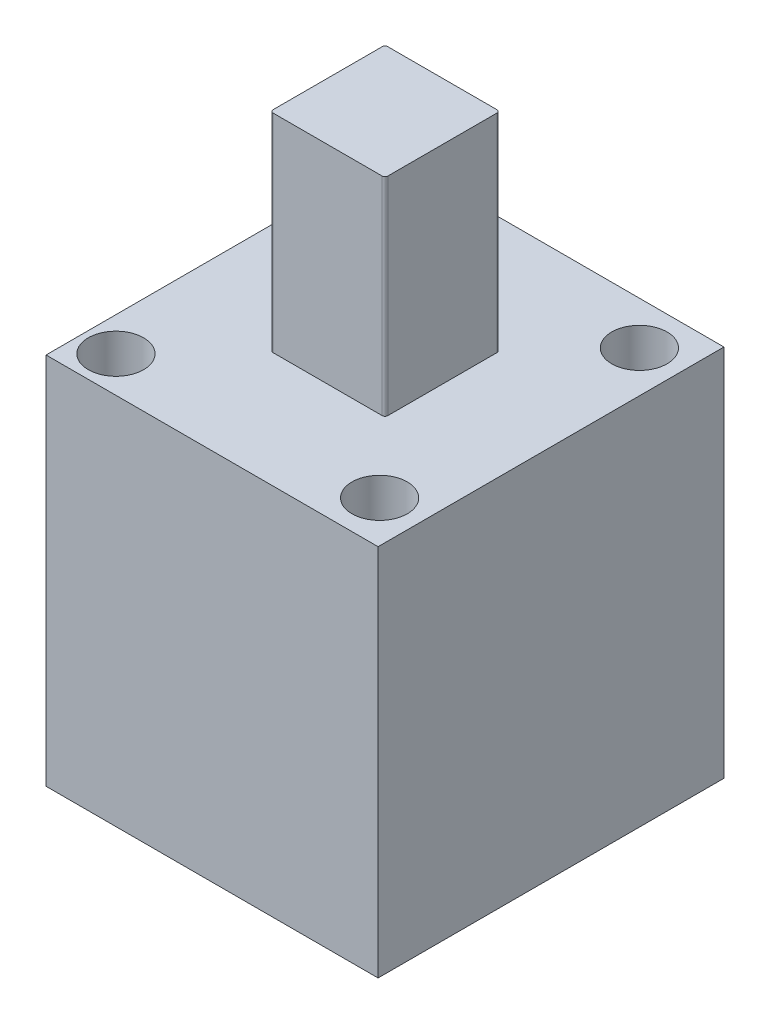
ISO-10303-21;
HEADER;
FILE_DESCRIPTION(('STEP AP214'),'2;1');
FILE_NAME('part.step','',(''),(''),'','','');
FILE_SCHEMA(('AUTOMOTIVE_DESIGN { 1 0 10303 214 1 1 1 1 }'));
ENDSEC;
DATA;
#1=APPLICATION_CONTEXT('core data for automotive mechanical design processes');
#2=APPLICATION_PROTOCOL_DEFINITION('international standard','automotive_design',2000,#1);
#3=PRODUCT_CONTEXT('',#1,'mechanical');
#4=PRODUCT('Part','Part','',(#3));
#5=PRODUCT_RELATED_PRODUCT_CATEGORY('part','',(#4));
#6=PRODUCT_DEFINITION_FORMATION('','',#4);
#7=PRODUCT_DEFINITION_CONTEXT('part definition',#1,'design');
#8=PRODUCT_DEFINITION('design','',#6,#7);
#9=PRODUCT_DEFINITION_SHAPE('','',#8);
#10=(LENGTH_UNIT() NAMED_UNIT(*) SI_UNIT(.MILLI.,.METRE.));
#11=(NAMED_UNIT(*) PLANE_ANGLE_UNIT() SI_UNIT($,.RADIAN.));
#12=(NAMED_UNIT(*) SI_UNIT($,.STERADIAN.) SOLID_ANGLE_UNIT());
#13=UNCERTAINTY_MEASURE_WITH_UNIT(LENGTH_MEASURE(1.E-05),#10,'distance_accuracy_value','');
#14=(GEOMETRIC_REPRESENTATION_CONTEXT(3) GLOBAL_UNCERTAINTY_ASSIGNED_CONTEXT((#13)) GLOBAL_UNIT_ASSIGNED_CONTEXT((#10,
#11,#12)) REPRESENTATION_CONTEXT('',''));
#15=CARTESIAN_POINT('',(0.,0.,0.));
#16=DIRECTION('',(0.,0.,1.));
#17=DIRECTION('',(1.,0.,0.));
#18=AXIS2_PLACEMENT_3D('',#15,#16,#17);
#19=CARTESIAN_POINT('',(-49.,13.9227642276423,25.));
#20=DIRECTION('',(1.,0.,0.));
#21=DIRECTION('',(0.,0.,-1.));
#22=AXIS2_PLACEMENT_3D('',#19,#20,#21);
#23=PLANE('',#22);
#24=DIRECTION('',(0.,-1.,0.));
#25=VECTOR('',#24,1.);
#26=CARTESIAN_POINT('',(-49.,13.9227642276423,0.));
#27=LINE('',#26,#25);
#28=CARTESIAN_POINT('',(-49.,13.9227642276423,0.));
#29=VERTEX_POINT('',#28);
#30=CARTESIAN_POINT('',(-49.,-13.0772357723577,0.));
#31=VERTEX_POINT('',#30);
#32=EDGE_CURVE('E158',#29,#31,#27,.T.);
#33=ORIENTED_EDGE('',*,*,#32,.T.);
#34=DIRECTION('',(0.,0.,-1.));
#35=VECTOR('',#34,1.);
#36=CARTESIAN_POINT('',(-49.,-13.0772357723577,25.));
#37=LINE('',#36,#35);
#38=CARTESIAN_POINT('',(-49.,-13.0772357723577,25.));
#39=VERTEX_POINT('',#38);
#40=EDGE_CURVE('E11',#39,#31,#37,.T.);
#41=ORIENTED_EDGE('',*,*,#40,.F.);
#42=DIRECTION('',(0.,-1.,0.));
#43=VECTOR('',#42,1.);
#44=CARTESIAN_POINT('',(-49.,13.9227642276423,25.));
#45=LINE('',#44,#43);
#46=CARTESIAN_POINT('',(-49.,13.9227642276423,25.));
#47=VERTEX_POINT('',#46);
#48=EDGE_CURVE('E169',#47,#39,#45,.T.);
#49=ORIENTED_EDGE('',*,*,#48,.F.);
#50=DIRECTION('',(0.,0.,-1.));
#51=VECTOR('',#50,1.);
#52=CARTESIAN_POINT('',(-49.,13.9227642276423,25.));
#53=LINE('',#52,#51);
#54=EDGE_CURVE('E182',#47,#29,#53,.T.);
#55=ORIENTED_EDGE('',*,*,#54,.T.);
#56=EDGE_LOOP('',(#33,#41,#49,#55));
#57=FACE_BOUND('',#56,.T.);
#58=ADVANCED_FACE('F45',(#57),#23,.F.);
#59=CARTESIAN_POINT('',(-49.,-13.0772357723577,25.));
#60=DIRECTION('',(0.,1.,0.));
#61=DIRECTION('',(0.,0.,1.));
#62=AXIS2_PLACEMENT_3D('',#59,#60,#61);
#63=PLANE('',#62);
#64=CARTESIAN_POINT('',(-28.,-13.0772357723577,21.888198757764));
#65=DIRECTION('',(0.,1.,0.));
#66=DIRECTION('',(0.,0.,1.));
#67=AXIS2_PLACEMENT_3D('',#64,#65,#66);
#68=CIRCLE('',#67,2.00000000000001);
#69=CARTESIAN_POINT('',(-28.,-13.0772357723577,23.888198757764));
#70=VERTEX_POINT('',#69);
#71=EDGE_CURVE('E307',#70,#70,#68,.T.);
#72=ORIENTED_EDGE('',*,*,#71,.T.);
#73=EDGE_LOOP('',(#72));
#74=FACE_BOUND('',#73,.T.);
#75=CARTESIAN_POINT('',(-46.,-13.0772357723577,3.26751592356688));
#76=DIRECTION('',(0.,1.,0.));
#77=DIRECTION('',(0.,0.,1.));
#78=AXIS2_PLACEMENT_3D('',#75,#76,#77);
#79=CIRCLE('',#78,2.00000000000001);
#80=CARTESIAN_POINT('',(-46.,-13.0772357723577,5.26751592356689));
#81=VERTEX_POINT('',#80);
#82=EDGE_CURVE('E293',#81,#81,#79,.T.);
#83=ORIENTED_EDGE('',*,*,#82,.T.);
#84=EDGE_LOOP('',(#83));
#85=FACE_BOUND('',#84,.T.);
#86=CARTESIAN_POINT('',(-28.,-13.0772357723577,3.11180124223603));
#87=DIRECTION('',(0.,1.,0.));
#88=DIRECTION('',(0.,0.,1.));
#89=AXIS2_PLACEMENT_3D('',#86,#87,#88);
#90=CIRCLE('',#89,2.);
#91=CARTESIAN_POINT('',(-28.,-13.0772357723577,5.11180124223603));
#92=VERTEX_POINT('',#91);
#93=EDGE_CURVE('E287',#92,#92,#90,.T.);
#94=ORIENTED_EDGE('',*,*,#93,.T.);
#95=EDGE_LOOP('',(#94));
#96=FACE_BOUND('',#95,.T.);
#97=CARTESIAN_POINT('',(-46.5514892192951,-13.0772357723577,22.3966882815415));
#98=DIRECTION('',(0.,1.,0.));
#99=DIRECTION('',(0.,0.,1.));
#100=AXIS2_PLACEMENT_3D('',#97,#98,#99);
#101=CIRCLE('',#100,2.);
#102=CARTESIAN_POINT('',(-46.5514892192951,-13.0772357723577,24.3966882815415));
#103=VERTEX_POINT('',#102);
#104=EDGE_CURVE('E313',#103,#103,#101,.T.);
#105=ORIENTED_EDGE('',*,*,#104,.T.);
#106=EDGE_LOOP('',(#105));
#107=FACE_BOUND('',#106,.T.);
#108=DIRECTION('',(1.,0.,0.));
#109=VECTOR('',#108,1.);
#110=CARTESIAN_POINT('',(-49.,-13.0772357723577,0.));
#111=LINE('',#110,#109);
#112=CARTESIAN_POINT('',(-25.,-13.0772357723577,0.));
#113=VERTEX_POINT('',#112);
#114=EDGE_CURVE('E163',#31,#113,#111,.T.);
#115=ORIENTED_EDGE('',*,*,#114,.T.);
#116=DIRECTION('',(0.,0.,-1.));
#117=VECTOR('',#116,1.);
#118=CARTESIAN_POINT('',(-25.,-13.0772357723577,25.));
#119=LINE('',#118,#117);
#120=CARTESIAN_POINT('',(-25.,-13.0772357723577,25.));
#121=VERTEX_POINT('',#120);
#122=EDGE_CURVE('E53',#121,#113,#119,.T.);
#123=ORIENTED_EDGE('',*,*,#122,.F.);
#124=DIRECTION('',(1.,0.,0.));
#125=VECTOR('',#124,1.);
#126=CARTESIAN_POINT('',(-49.,-13.0772357723577,25.));
#127=LINE('',#126,#125);
#128=EDGE_CURVE('E173',#39,#121,#127,.T.);
#129=ORIENTED_EDGE('',*,*,#128,.F.);
#130=ORIENTED_EDGE('',*,*,#40,.T.);
#131=EDGE_LOOP('',(#115,#123,#129,#130));
#132=FACE_BOUND('',#131,.T.);
#133=ADVANCED_FACE('F219',(#74,#85,#96,#107,#132),#63,.F.);
#134=CARTESIAN_POINT('',(-25.,13.9227642276423,25.));
#135=DIRECTION('',(-1.,0.,0.));
#136=DIRECTION('',(0.,0.,1.));
#137=AXIS2_PLACEMENT_3D('',#134,#135,#136);
#138=PLANE('',#137);
#139=DIRECTION('',(0.,1.,0.));
#140=VECTOR('',#139,1.);
#141=CARTESIAN_POINT('',(-25.,13.9227642276423,0.));
#142=LINE('',#141,#140);
#143=CARTESIAN_POINT('',(-25.,13.9227642276423,0.));
#144=VERTEX_POINT('',#143);
#145=EDGE_CURVE('E186',#113,#144,#142,.T.);
#146=ORIENTED_EDGE('',*,*,#145,.T.);
#147=DIRECTION('',(0.,0.,-1.));
#148=VECTOR('',#147,1.);
#149=CARTESIAN_POINT('',(-25.,13.9227642276423,25.));
#150=LINE('',#149,#148);
#151=CARTESIAN_POINT('',(-25.,13.9227642276423,25.));
#152=VERTEX_POINT('',#151);
#153=EDGE_CURVE('E194',#152,#144,#150,.T.);
#154=ORIENTED_EDGE('',*,*,#153,.F.);
#155=DIRECTION('',(0.,1.,0.));
#156=VECTOR('',#155,1.);
#157=CARTESIAN_POINT('',(-25.,13.9227642276423,25.));
#158=LINE('',#157,#156);
#159=EDGE_CURVE('E177',#121,#152,#158,.T.);
#160=ORIENTED_EDGE('',*,*,#159,.F.);
#161=ORIENTED_EDGE('',*,*,#122,.T.);
#162=EDGE_LOOP('',(#146,#154,#160,#161));
#163=FACE_BOUND('',#162,.T.);
#164=ADVANCED_FACE('F203',(#163),#138,.F.);
#165=CARTESIAN_POINT('',(-49.,13.9227642276423,25.));
#166=DIRECTION('',(0.,-1.,0.));
#167=DIRECTION('',(0.,0.,-1.));
#168=AXIS2_PLACEMENT_3D('',#165,#166,#167);
#169=PLANE('',#168);
#170=CARTESIAN_POINT('',(-28.,13.9227642276423,21.888198757764));
#171=DIRECTION('',(0.,1.,0.));
#172=DIRECTION('',(0.,0.,1.));
#173=AXIS2_PLACEMENT_3D('',#170,#171,#172);
#174=CIRCLE('',#173,2.00000000000001);
#175=CARTESIAN_POINT('',(-28.,13.9227642276423,23.888198757764));
#176=VERTEX_POINT('',#175);
#177=EDGE_CURVE('E302',#176,#176,#174,.T.);
#178=ORIENTED_EDGE('',*,*,#177,.F.);
#179=EDGE_LOOP('',(#178));
#180=FACE_BOUND('',#179,.T.);
#181=CARTESIAN_POINT('',(-46.,13.9227642276423,3.26751592356688));
#182=DIRECTION('',(0.,1.,0.));
#183=DIRECTION('',(0.,0.,1.));
#184=AXIS2_PLACEMENT_3D('',#181,#182,#183);
#185=CIRCLE('',#184,2.00000000000001);
#186=CARTESIAN_POINT('',(-46.,13.9227642276423,5.26751592356689));
#187=VERTEX_POINT('',#186);
#188=EDGE_CURVE('E298',#187,#187,#185,.T.);
#189=ORIENTED_EDGE('',*,*,#188,.F.);
#190=EDGE_LOOP('',(#189));
#191=FACE_BOUND('',#190,.T.);
#192=CARTESIAN_POINT('',(-28.,13.9227642276423,3.11180124223603));
#193=DIRECTION('',(0.,1.,0.));
#194=DIRECTION('',(0.,0.,1.));
#195=AXIS2_PLACEMENT_3D('',#192,#193,#194);
#196=CIRCLE('',#195,2.);
#197=CARTESIAN_POINT('',(-28.,13.9227642276423,5.11180124223603));
#198=VERTEX_POINT('',#197);
#199=EDGE_CURVE('E290',#198,#198,#196,.T.);
#200=ORIENTED_EDGE('',*,*,#199,.F.);
#201=EDGE_LOOP('',(#200));
#202=FACE_BOUND('',#201,.T.);
#203=CARTESIAN_POINT('',(-46.5514892192951,13.9227642276423,22.3966882815415));
#204=DIRECTION('',(0.,1.,0.));
#205=DIRECTION('',(0.,0.,1.));
#206=AXIS2_PLACEMENT_3D('',#203,#204,#205);
#207=CIRCLE('',#206,2.);
#208=CARTESIAN_POINT('',(-46.5514892192951,13.9227642276423,24.3966882815415));
#209=VERTEX_POINT('',#208);
#210=EDGE_CURVE('E306',#209,#209,#207,.T.);
#211=ORIENTED_EDGE('',*,*,#210,.F.);
#212=EDGE_LOOP('',(#211));
#213=FACE_BOUND('',#212,.T.);
#214=DIRECTION('',(0.,0.,1.));
#215=VECTOR('',#214,1.);
#216=CARTESIAN_POINT('',(-41.15,13.9227642276423,8.55));
#217=LINE('',#216,#215);
#218=CARTESIAN_POINT('',(-41.15,13.9227642276423,8.55));
#219=VERTEX_POINT('',#218);
#220=CARTESIAN_POINT('',(-41.15,13.9227642276423,16.45));
#221=VERTEX_POINT('',#220);
#222=EDGE_CURVE('E60',#219,#221,#217,.T.);
#223=ORIENTED_EDGE('',*,*,#222,.F.);
#224=CARTESIAN_POINT('',(-40.95,13.9227642276423,8.55));
#225=DIRECTION('',(0.,1.,0.));
#226=DIRECTION('',(0.,0.,1.));
#227=AXIS2_PLACEMENT_3D('',#224,#225,#226);
#228=CIRCLE('',#227,0.200000000000003);
#229=CARTESIAN_POINT('',(-40.95,13.9227642276423,8.35));
#230=VERTEX_POINT('',#229);
#231=EDGE_CURVE('E64',#230,#219,#228,.T.);
#232=ORIENTED_EDGE('',*,*,#231,.F.);
#233=DIRECTION('',(1.,0.,0.));
#234=VECTOR('',#233,1.);
#235=CARTESIAN_POINT('',(-40.95,13.9227642276423,8.35));
#236=LINE('',#235,#234);
#237=CARTESIAN_POINT('',(-33.05,13.9227642276423,8.35));
#238=VERTEX_POINT('',#237);
#239=EDGE_CURVE('E359',#230,#238,#236,.T.);
#240=ORIENTED_EDGE('',*,*,#239,.T.);
#241=CARTESIAN_POINT('',(-33.05,13.9227642276423,8.55));
#242=DIRECTION('',(0.,-1.,0.));
#243=DIRECTION('',(0.,0.,-1.));
#244=AXIS2_PLACEMENT_3D('',#241,#242,#243);
#245=CIRCLE('',#244,0.200000000000003);
#246=CARTESIAN_POINT('',(-32.85,13.9227642276423,8.55));
#247=VERTEX_POINT('',#246);
#248=EDGE_CURVE('E356',#238,#247,#245,.T.);
#249=ORIENTED_EDGE('',*,*,#248,.T.);
#250=DIRECTION('',(0.,0.,1.));
#251=VECTOR('',#250,1.);
#252=CARTESIAN_POINT('',(-32.85,13.9227642276423,8.55));
#253=LINE('',#252,#251);
#254=CARTESIAN_POINT('',(-32.85,13.9227642276423,16.45));
#255=VERTEX_POINT('',#254);
#256=EDGE_CURVE('E353',#247,#255,#253,.T.);
#257=ORIENTED_EDGE('',*,*,#256,.T.);
#258=CARTESIAN_POINT('',(-33.05,13.9227642276423,16.45));
#259=DIRECTION('',(0.,1.,0.));
#260=DIRECTION('',(0.,0.,1.));
#261=AXIS2_PLACEMENT_3D('',#258,#259,#260);
#262=CIRCLE('',#261,0.200000000000001);
#263=CARTESIAN_POINT('',(-33.05,13.9227642276423,16.65));
#264=VERTEX_POINT('',#263);
#265=EDGE_CURVE('E349',#264,#255,#262,.T.);
#266=ORIENTED_EDGE('',*,*,#265,.F.);
#267=DIRECTION('',(1.,0.,0.));
#268=VECTOR('',#267,1.);
#269=CARTESIAN_POINT('',(-40.95,13.9227642276423,16.65));
#270=LINE('',#269,#268);
#271=CARTESIAN_POINT('',(-40.95,13.9227642276423,16.65));
#272=VERTEX_POINT('',#271);
#273=EDGE_CURVE('E345',#272,#264,#270,.T.);
#274=ORIENTED_EDGE('',*,*,#273,.F.);
#275=CARTESIAN_POINT('',(-40.95,13.9227642276423,16.45));
#276=DIRECTION('',(0.,1.,0.));
#277=DIRECTION('',(0.,0.,1.));
#278=AXIS2_PLACEMENT_3D('',#275,#276,#277);
#279=CIRCLE('',#278,0.200000000000004);
#280=EDGE_CURVE('E342',#221,#272,#279,.T.);
#281=ORIENTED_EDGE('',*,*,#280,.F.);
#282=EDGE_LOOP('',(#223,#232,#240,#249,#257,#266,#274,#281));
#283=FACE_BOUND('',#282,.T.);
#284=DIRECTION('',(-1.,0.,0.));
#285=VECTOR('',#284,1.);
#286=CARTESIAN_POINT('',(-49.,13.9227642276423,0.));
#287=LINE('',#286,#285);
#288=EDGE_CURVE('E174',#144,#29,#287,.T.);
#289=ORIENTED_EDGE('',*,*,#288,.T.);
#290=ORIENTED_EDGE('',*,*,#54,.F.);
#291=DIRECTION('',(-1.,0.,0.));
#292=VECTOR('',#291,1.);
#293=CARTESIAN_POINT('',(-49.,13.9227642276423,25.));
#294=LINE('',#293,#292);
#295=EDGE_CURVE('E180',#152,#47,#294,.T.);
#296=ORIENTED_EDGE('',*,*,#295,.F.);
#297=ORIENTED_EDGE('',*,*,#153,.T.);
#298=EDGE_LOOP('',(#289,#290,#296,#297));
#299=FACE_BOUND('',#298,.T.);
#300=ADVANCED_FACE('F212',(#180,#191,#202,#213,#283,#299),#169,.F.);
#301=CARTESIAN_POINT('',(0.,0.,25.));
#302=DIRECTION('',(0.,0.,1.));
#303=DIRECTION('',(1.,0.,0.));
#304=AXIS2_PLACEMENT_3D('',#301,#302,#303);
#305=PLANE('',#304);
#306=ORIENTED_EDGE('',*,*,#48,.T.);
#307=ORIENTED_EDGE('',*,*,#128,.T.);
#308=ORIENTED_EDGE('',*,*,#159,.T.);
#309=ORIENTED_EDGE('',*,*,#295,.T.);
#310=EDGE_LOOP('',(#306,#307,#308,#309));
#311=FACE_BOUND('',#310,.T.);
#312=ADVANCED_FACE('F218',(#311),#305,.T.);
#313=CARTESIAN_POINT('',(0.,0.,0.));
#314=DIRECTION('',(0.,0.,1.));
#315=DIRECTION('',(1.,0.,0.));
#316=AXIS2_PLACEMENT_3D('',#313,#314,#315);
#317=PLANE('',#316);
#318=ORIENTED_EDGE('',*,*,#32,.F.);
#319=ORIENTED_EDGE('',*,*,#288,.F.);
#320=ORIENTED_EDGE('',*,*,#145,.F.);
#321=ORIENTED_EDGE('',*,*,#114,.F.);
#322=EDGE_LOOP('',(#318,#319,#320,#321));
#323=FACE_BOUND('',#322,.T.);
#324=ADVANCED_FACE('F209',(#323),#317,.F.);
#325=CARTESIAN_POINT('',(-41.15,28.9227642276423,8.55));
#326=DIRECTION('',(1.,0.,0.));
#327=DIRECTION('',(0.,0.,-1.));
#328=AXIS2_PLACEMENT_3D('',#325,#326,#327);
#329=PLANE('',#328);
#330=ORIENTED_EDGE('',*,*,#222,.T.);
#331=DIRECTION('',(0.,-1.,0.));
#332=VECTOR('',#331,1.);
#333=CARTESIAN_POINT('',(-41.15,28.9227642276423,16.45));
#334=LINE('',#333,#332);
#335=CARTESIAN_POINT('',(-41.15,28.9227642276423,16.45));
#336=VERTEX_POINT('',#335);
#337=EDGE_CURVE('E137',#336,#221,#334,.T.);
#338=ORIENTED_EDGE('',*,*,#337,.F.);
#339=DIRECTION('',(0.,0.,1.));
#340=VECTOR('',#339,1.);
#341=CARTESIAN_POINT('',(-41.15,28.9227642276423,8.55));
#342=LINE('',#341,#340);
#343=CARTESIAN_POINT('',(-41.15,28.9227642276423,8.55));
#344=VERTEX_POINT('',#343);
#345=EDGE_CURVE('E144',#344,#336,#342,.T.);
#346=ORIENTED_EDGE('',*,*,#345,.F.);
#347=DIRECTION('',(0.,-1.,0.));
#348=VECTOR('',#347,1.);
#349=CARTESIAN_POINT('',(-41.15,28.9227642276423,8.55));
#350=LINE('',#349,#348);
#351=EDGE_CURVE('E339',#344,#219,#350,.T.);
#352=ORIENTED_EDGE('',*,*,#351,.T.);
#353=EDGE_LOOP('',(#330,#338,#346,#352));
#354=FACE_BOUND('',#353,.T.);
#355=ADVANCED_FACE('F156',(#354),#329,.F.);
#356=CARTESIAN_POINT('',(-40.95,28.9227642276423,16.45));
#357=DIRECTION('',(0.,-1.,0.));
#358=DIRECTION('',(0.,0.,-1.));
#359=AXIS2_PLACEMENT_3D('',#356,#357,#358);
#360=CYLINDRICAL_SURFACE('',#359,0.200000000000004);
#361=ORIENTED_EDGE('',*,*,#280,.T.);
#362=DIRECTION('',(0.,-1.,0.));
#363=VECTOR('',#362,1.);
#364=CARTESIAN_POINT('',(-40.95,28.9227642276423,16.65));
#365=LINE('',#364,#363);
#366=CARTESIAN_POINT('',(-40.95,28.9227642276423,16.65));
#367=VERTEX_POINT('',#366);
#368=EDGE_CURVE('E139',#367,#272,#365,.T.);
#369=ORIENTED_EDGE('',*,*,#368,.F.);
#370=CARTESIAN_POINT('',(-40.95,28.9227642276423,16.45));
#371=DIRECTION('',(0.,1.,0.));
#372=DIRECTION('',(0.,0.,1.));
#373=AXIS2_PLACEMENT_3D('',#370,#371,#372);
#374=CIRCLE('',#373,0.200000000000004);
#375=EDGE_CURVE('E132',#336,#367,#374,.T.);
#376=ORIENTED_EDGE('',*,*,#375,.F.);
#377=ORIENTED_EDGE('',*,*,#337,.T.);
#378=EDGE_LOOP('',(#361,#369,#376,#377));
#379=FACE_BOUND('',#378,.T.);
#380=ADVANCED_FACE('F135',(#379),#360,.T.);
#381=CARTESIAN_POINT('',(-40.95,28.9227642276423,16.65));
#382=DIRECTION('',(0.,0.,-1.));
#383=DIRECTION('',(-1.,0.,0.));
#384=AXIS2_PLACEMENT_3D('',#381,#382,#383);
#385=PLANE('',#384);
#386=ORIENTED_EDGE('',*,*,#273,.T.);
#387=DIRECTION('',(0.,-1.,0.));
#388=VECTOR('',#387,1.);
#389=CARTESIAN_POINT('',(-33.05,28.9227642276423,16.65));
#390=LINE('',#389,#388);
#391=CARTESIAN_POINT('',(-33.05,28.9227642276423,16.65));
#392=VERTEX_POINT('',#391);
#393=EDGE_CURVE('E165',#392,#264,#390,.T.);
#394=ORIENTED_EDGE('',*,*,#393,.F.);
#395=DIRECTION('',(1.,0.,0.));
#396=VECTOR('',#395,1.);
#397=CARTESIAN_POINT('',(-40.95,28.9227642276423,16.65));
#398=LINE('',#397,#396);
#399=EDGE_CURVE('E143',#367,#392,#398,.T.);
#400=ORIENTED_EDGE('',*,*,#399,.F.);
#401=ORIENTED_EDGE('',*,*,#368,.T.);
#402=EDGE_LOOP('',(#386,#394,#400,#401));
#403=FACE_BOUND('',#402,.T.);
#404=ADVANCED_FACE('F242',(#403),#385,.F.);
#405=CARTESIAN_POINT('',(-33.05,28.9227642276423,16.45));
#406=DIRECTION('',(0.,-1.,0.));
#407=DIRECTION('',(0.,0.,-1.));
#408=AXIS2_PLACEMENT_3D('',#405,#406,#407);
#409=CYLINDRICAL_SURFACE('',#408,0.200000000000001);
#410=ORIENTED_EDGE('',*,*,#265,.T.);
#411=DIRECTION('',(0.,-1.,0.));
#412=VECTOR('',#411,1.);
#413=CARTESIAN_POINT('',(-32.85,28.9227642276423,16.45));
#414=LINE('',#413,#412);
#415=CARTESIAN_POINT('',(-32.85,28.9227642276423,16.45));
#416=VERTEX_POINT('',#415);
#417=EDGE_CURVE('E377',#416,#255,#414,.T.);
#418=ORIENTED_EDGE('',*,*,#417,.F.);
#419=CARTESIAN_POINT('',(-33.05,28.9227642276423,16.45));
#420=DIRECTION('',(0.,1.,0.));
#421=DIRECTION('',(0.,0.,1.));
#422=AXIS2_PLACEMENT_3D('',#419,#420,#421);
#423=CIRCLE('',#422,0.200000000000001);
#424=EDGE_CURVE('E322',#392,#416,#423,.T.);
#425=ORIENTED_EDGE('',*,*,#424,.F.);
#426=ORIENTED_EDGE('',*,*,#393,.T.);
#427=EDGE_LOOP('',(#410,#418,#425,#426));
#428=FACE_BOUND('',#427,.T.);
#429=ADVANCED_FACE('F245',(#428),#409,.T.);
#430=CARTESIAN_POINT('',(-32.85,28.9227642276423,8.55));
#431=DIRECTION('',(1.,0.,0.));
#432=DIRECTION('',(0.,0.,-1.));
#433=AXIS2_PLACEMENT_3D('',#430,#431,#432);
#434=PLANE('',#433);
#435=ORIENTED_EDGE('',*,*,#256,.F.);
#436=DIRECTION('',(0.,-1.,0.));
#437=VECTOR('',#436,1.);
#438=CARTESIAN_POINT('',(-32.85,28.9227642276423,8.55));
#439=LINE('',#438,#437);
#440=CARTESIAN_POINT('',(-32.85,28.9227642276423,8.55));
#441=VERTEX_POINT('',#440);
#442=EDGE_CURVE('E373',#441,#247,#439,.T.);
#443=ORIENTED_EDGE('',*,*,#442,.F.);
#444=DIRECTION('',(0.,0.,1.));
#445=VECTOR('',#444,1.);
#446=CARTESIAN_POINT('',(-32.85,28.9227642276423,8.55));
#447=LINE('',#446,#445);
#448=EDGE_CURVE('E325',#441,#416,#447,.T.);
#449=ORIENTED_EDGE('',*,*,#448,.T.);
#450=ORIENTED_EDGE('',*,*,#417,.T.);
#451=EDGE_LOOP('',(#435,#443,#449,#450));
#452=FACE_BOUND('',#451,.T.);
#453=ADVANCED_FACE('F249',(#452),#434,.T.);
#454=CARTESIAN_POINT('',(-33.05,28.9227642276423,8.55));
#455=DIRECTION('',(0.,-1.,0.));
#456=DIRECTION('',(0.,0.,-1.));
#457=AXIS2_PLACEMENT_3D('',#454,#455,#456);
#458=CYLINDRICAL_SURFACE('',#457,0.200000000000003);
#459=ORIENTED_EDGE('',*,*,#248,.F.);
#460=DIRECTION('',(0.,-1.,0.));
#461=VECTOR('',#460,1.);
#462=CARTESIAN_POINT('',(-33.05,28.9227642276423,8.35));
#463=LINE('',#462,#461);
#464=CARTESIAN_POINT('',(-33.05,28.9227642276423,8.35));
#465=VERTEX_POINT('',#464);
#466=EDGE_CURVE('E369',#465,#238,#463,.T.);
#467=ORIENTED_EDGE('',*,*,#466,.F.);
#468=CARTESIAN_POINT('',(-33.05,28.9227642276423,8.55));
#469=DIRECTION('',(0.,-1.,0.));
#470=DIRECTION('',(0.,0.,-1.));
#471=AXIS2_PLACEMENT_3D('',#468,#469,#470);
#472=CIRCLE('',#471,0.200000000000003);
#473=EDGE_CURVE('E329',#465,#441,#472,.T.);
#474=ORIENTED_EDGE('',*,*,#473,.T.);
#475=ORIENTED_EDGE('',*,*,#442,.T.);
#476=EDGE_LOOP('',(#459,#467,#474,#475));
#477=FACE_BOUND('',#476,.T.);
#478=ADVANCED_FACE('F253',(#477),#458,.T.);
#479=CARTESIAN_POINT('',(-40.95,28.9227642276423,8.35));
#480=DIRECTION('',(0.,0.,-1.));
#481=DIRECTION('',(-1.,0.,0.));
#482=AXIS2_PLACEMENT_3D('',#479,#480,#481);
#483=PLANE('',#482);
#484=ORIENTED_EDGE('',*,*,#239,.F.);
#485=DIRECTION('',(0.,-1.,0.));
#486=VECTOR('',#485,1.);
#487=CARTESIAN_POINT('',(-40.95,28.9227642276423,8.35));
#488=LINE('',#487,#486);
#489=CARTESIAN_POINT('',(-40.95,28.9227642276423,8.35));
#490=VERTEX_POINT('',#489);
#491=EDGE_CURVE('E366',#490,#230,#488,.T.);
#492=ORIENTED_EDGE('',*,*,#491,.F.);
#493=DIRECTION('',(1.,0.,0.));
#494=VECTOR('',#493,1.);
#495=CARTESIAN_POINT('',(-40.95,28.9227642276423,8.35));
#496=LINE('',#495,#494);
#497=EDGE_CURVE('E333',#490,#465,#496,.T.);
#498=ORIENTED_EDGE('',*,*,#497,.T.);
#499=ORIENTED_EDGE('',*,*,#466,.T.);
#500=EDGE_LOOP('',(#484,#492,#498,#499));
#501=FACE_BOUND('',#500,.T.);
#502=ADVANCED_FACE('F257',(#501),#483,.T.);
#503=CARTESIAN_POINT('',(-40.95,28.9227642276423,8.55));
#504=DIRECTION('',(0.,-1.,0.));
#505=DIRECTION('',(0.,0.,-1.));
#506=AXIS2_PLACEMENT_3D('',#503,#504,#505);
#507=CYLINDRICAL_SURFACE('',#506,0.200000000000003);
#508=ORIENTED_EDGE('',*,*,#231,.T.);
#509=ORIENTED_EDGE('',*,*,#351,.F.);
#510=CARTESIAN_POINT('',(-40.95,28.9227642276423,8.55));
#511=DIRECTION('',(0.,1.,0.));
#512=DIRECTION('',(0.,0.,1.));
#513=AXIS2_PLACEMENT_3D('',#510,#511,#512);
#514=CIRCLE('',#513,0.200000000000003);
#515=EDGE_CURVE('E150',#490,#344,#514,.T.);
#516=ORIENTED_EDGE('',*,*,#515,.F.);
#517=ORIENTED_EDGE('',*,*,#491,.T.);
#518=EDGE_LOOP('',(#508,#509,#516,#517));
#519=FACE_BOUND('',#518,.T.);
#520=ADVANCED_FACE('F261',(#519),#507,.T.);
#521=CARTESIAN_POINT('',(-40.95,28.9227642276423,16.45));
#522=DIRECTION('',(0.,1.,0.));
#523=DIRECTION('',(0.,0.,1.));
#524=AXIS2_PLACEMENT_3D('',#521,#522,#523);
#525=PLANE('',#524);
#526=ORIENTED_EDGE('',*,*,#345,.T.);
#527=ORIENTED_EDGE('',*,*,#375,.T.);
#528=ORIENTED_EDGE('',*,*,#399,.T.);
#529=ORIENTED_EDGE('',*,*,#424,.T.);
#530=ORIENTED_EDGE('',*,*,#448,.F.);
#531=ORIENTED_EDGE('',*,*,#473,.F.);
#532=ORIENTED_EDGE('',*,*,#497,.F.);
#533=ORIENTED_EDGE('',*,*,#515,.T.);
#534=EDGE_LOOP('',(#526,#527,#528,#529,#530,#531,#532,#533));
#535=FACE_BOUND('',#534,.T.);
#536=ADVANCED_FACE('F147',(#535),#525,.T.);
#537=CARTESIAN_POINT('',(-46.5514892192951,-13.0772357723577,22.3966882815415));
#538=DIRECTION('',(0.,1.,0.));
#539=DIRECTION('',(0.,0.,1.));
#540=AXIS2_PLACEMENT_3D('',#537,#538,#539);
#541=CYLINDRICAL_SURFACE('',#540,2.);
#542=ORIENTED_EDGE('',*,*,#104,.F.);
#543=EDGE_LOOP('',(#542));
#544=FACE_BOUND('',#543,.T.);
#545=ORIENTED_EDGE('',*,*,#210,.T.);
#546=EDGE_LOOP('',(#545));
#547=FACE_BOUND('',#546,.T.);
#548=ADVANCED_FACE('F267',(#544,#547),#541,.F.);
#549=CARTESIAN_POINT('',(-28.,-13.0772357723577,3.11180124223603));
#550=DIRECTION('',(0.,1.,0.));
#551=DIRECTION('',(0.,0.,1.));
#552=AXIS2_PLACEMENT_3D('',#549,#550,#551);
#553=CYLINDRICAL_SURFACE('',#552,2.);
#554=ORIENTED_EDGE('',*,*,#93,.F.);
#555=EDGE_LOOP('',(#554));
#556=FACE_BOUND('',#555,.T.);
#557=ORIENTED_EDGE('',*,*,#199,.T.);
#558=EDGE_LOOP('',(#557));
#559=FACE_BOUND('',#558,.T.);
#560=ADVANCED_FACE('F270',(#556,#559),#553,.F.);
#561=CARTESIAN_POINT('',(-46.,-13.0772357723577,3.26751592356688));
#562=DIRECTION('',(0.,1.,0.));
#563=DIRECTION('',(0.,0.,1.));
#564=AXIS2_PLACEMENT_3D('',#561,#562,#563);
#565=CYLINDRICAL_SURFACE('',#564,2.00000000000001);
#566=ORIENTED_EDGE('',*,*,#82,.F.);
#567=EDGE_LOOP('',(#566));
#568=FACE_BOUND('',#567,.T.);
#569=ORIENTED_EDGE('',*,*,#188,.T.);
#570=EDGE_LOOP('',(#569));
#571=FACE_BOUND('',#570,.T.);
#572=ADVANCED_FACE('F272',(#568,#571),#565,.F.);
#573=CARTESIAN_POINT('',(-28.,-13.0772357723577,21.888198757764));
#574=DIRECTION('',(0.,1.,0.));
#575=DIRECTION('',(0.,0.,1.));
#576=AXIS2_PLACEMENT_3D('',#573,#574,#575);
#577=CYLINDRICAL_SURFACE('',#576,2.00000000000001);
#578=ORIENTED_EDGE('',*,*,#71,.F.);
#579=EDGE_LOOP('',(#578));
#580=FACE_BOUND('',#579,.T.);
#581=ORIENTED_EDGE('',*,*,#177,.T.);
#582=EDGE_LOOP('',(#581));
#583=FACE_BOUND('',#582,.T.);
#584=ADVANCED_FACE('F275',(#580,#583),#577,.F.);
#585=CLOSED_SHELL('',(#58,#133,#164,#300,#312,#324,#355,#380,#404,#429,#453,#478,#502,#520,#536,
#548,#560,#572,#584));
#586=MANIFOLD_SOLID_BREP('B2',#585);
#587=ADVANCED_BREP_SHAPE_REPRESENTATION('',(#18,#586),#14);
#588=SHAPE_DEFINITION_REPRESENTATION(#9,#587);
ENDSEC;
END-ISO-10303-21;
